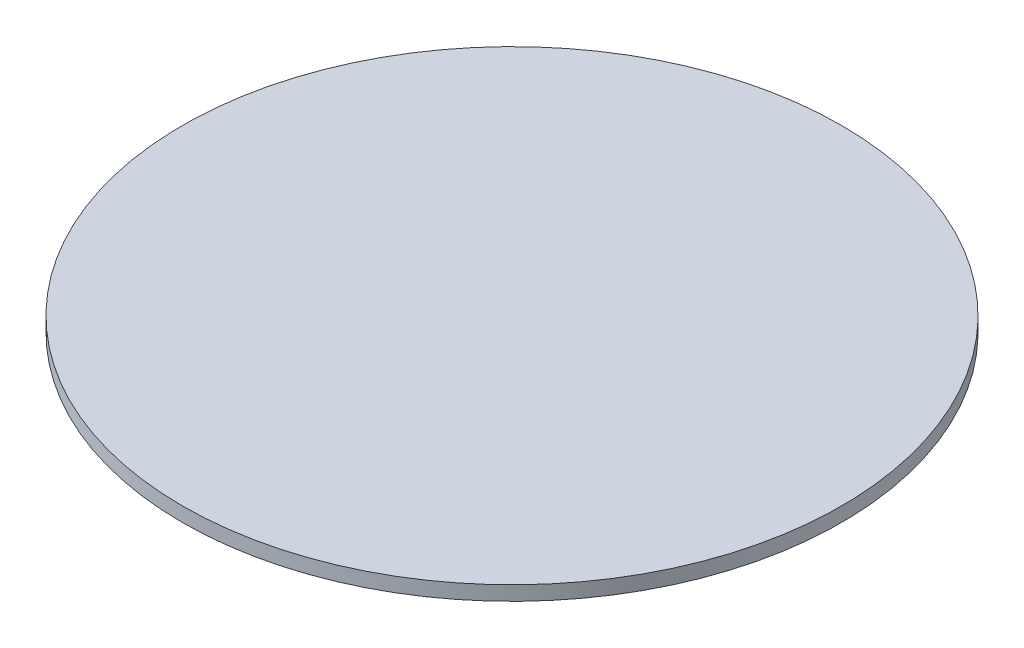
ISO-10303-21;
HEADER;
FILE_DESCRIPTION(('STEP AP214'),'2;1');
FILE_NAME('part.step','',(''),(''),'','','');
FILE_SCHEMA(('AUTOMOTIVE_DESIGN { 1 0 10303 214 1 1 1 1 }'));
ENDSEC;
DATA;
#1=APPLICATION_CONTEXT('core data for automotive mechanical design processes');
#2=APPLICATION_PROTOCOL_DEFINITION('international standard','automotive_design',2000,#1);
#3=PRODUCT_CONTEXT('',#1,'mechanical');
#4=PRODUCT('Part','Part','',(#3));
#5=PRODUCT_RELATED_PRODUCT_CATEGORY('part','',(#4));
#6=PRODUCT_DEFINITION_FORMATION('','',#4);
#7=PRODUCT_DEFINITION_CONTEXT('part definition',#1,'design');
#8=PRODUCT_DEFINITION('design','',#6,#7);
#9=PRODUCT_DEFINITION_SHAPE('','',#8);
#10=(LENGTH_UNIT() NAMED_UNIT(*) SI_UNIT(.MILLI.,.METRE.));
#11=(NAMED_UNIT(*) PLANE_ANGLE_UNIT() SI_UNIT($,.RADIAN.));
#12=(NAMED_UNIT(*) SI_UNIT($,.STERADIAN.) SOLID_ANGLE_UNIT());
#13=UNCERTAINTY_MEASURE_WITH_UNIT(LENGTH_MEASURE(1.E-05),#10,'distance_accuracy_value','');
#14=(GEOMETRIC_REPRESENTATION_CONTEXT(3) GLOBAL_UNCERTAINTY_ASSIGNED_CONTEXT((#13)) GLOBAL_UNIT_ASSIGNED_CONTEXT((#10,
#11,#12)) REPRESENTATION_CONTEXT('',''));
#15=CARTESIAN_POINT('',(0.,0.,0.));
#16=DIRECTION('',(0.,0.,1.));
#17=DIRECTION('',(1.,0.,0.));
#18=AXIS2_PLACEMENT_3D('',#15,#16,#17);
#19=CARTESIAN_POINT('',(0.,2.54,0.));
#20=DIRECTION('',(0.,-1.,0.));
#21=DIRECTION('',(0.,0.,-1.));
#22=AXIS2_PLACEMENT_3D('',#19,#20,#21);
#23=CYLINDRICAL_SURFACE('',#22,58.2056699963525);
#24=CARTESIAN_POINT('',(0.,2.54,0.));
#25=DIRECTION('',(0.,1.,0.));
#26=DIRECTION('',(0.,0.,1.));
#27=AXIS2_PLACEMENT_3D('',#24,#25,#26);
#28=CIRCLE('',#27,58.2056699963525);
#29=CARTESIAN_POINT('',(0.,2.54,58.2056699963525));
#30=VERTEX_POINT('',#29);
#31=EDGE_CURVE('E10',#30,#30,#28,.T.);
#32=ORIENTED_EDGE('',*,*,#31,.F.);
#33=EDGE_LOOP('',(#32));
#34=FACE_BOUND('',#33,.T.);
#35=CARTESIAN_POINT('',(0.,0.,0.));
#36=DIRECTION('',(0.,1.,0.));
#37=DIRECTION('',(0.,0.,1.));
#38=AXIS2_PLACEMENT_3D('',#35,#36,#37);
#39=CIRCLE('',#38,58.2056699963525);
#40=CARTESIAN_POINT('',(0.,0.,58.2056699963525));
#41=VERTEX_POINT('',#40);
#42=EDGE_CURVE('E34',#41,#41,#39,.T.);
#43=ORIENTED_EDGE('',*,*,#42,.T.);
#44=EDGE_LOOP('',(#43));
#45=FACE_BOUND('',#44,.T.);
#46=ADVANCED_FACE('F31',(#34,#45),#23,.T.);
#47=CARTESIAN_POINT('',(0.,2.54,0.));
#48=DIRECTION('',(0.,1.,0.));
#49=DIRECTION('',(0.,0.,1.));
#50=AXIS2_PLACEMENT_3D('',#47,#48,#49);
#51=PLANE('',#50);
#52=ORIENTED_EDGE('',*,*,#31,.T.);
#53=EDGE_LOOP('',(#52));
#54=FACE_BOUND('',#53,.T.);
#55=ADVANCED_FACE('F46',(#54),#51,.T.);
#56=CARTESIAN_POINT('',(0.,0.,0.));
#57=DIRECTION('',(0.,1.,0.));
#58=DIRECTION('',(0.,0.,1.));
#59=AXIS2_PLACEMENT_3D('',#56,#57,#58);
#60=PLANE('',#59);
#61=ORIENTED_EDGE('',*,*,#42,.F.);
#62=EDGE_LOOP('',(#61));
#63=FACE_BOUND('',#62,.T.);
#64=ADVANCED_FACE('F44',(#63),#60,.F.);
#65=CLOSED_SHELL('',(#46,#55,#64));
#66=MANIFOLD_SOLID_BREP('B2',#65);
#67=ADVANCED_BREP_SHAPE_REPRESENTATION('',(#18,#66),#14);
#68=SHAPE_DEFINITION_REPRESENTATION(#9,#67);
ENDSEC;
END-ISO-10303-21;
